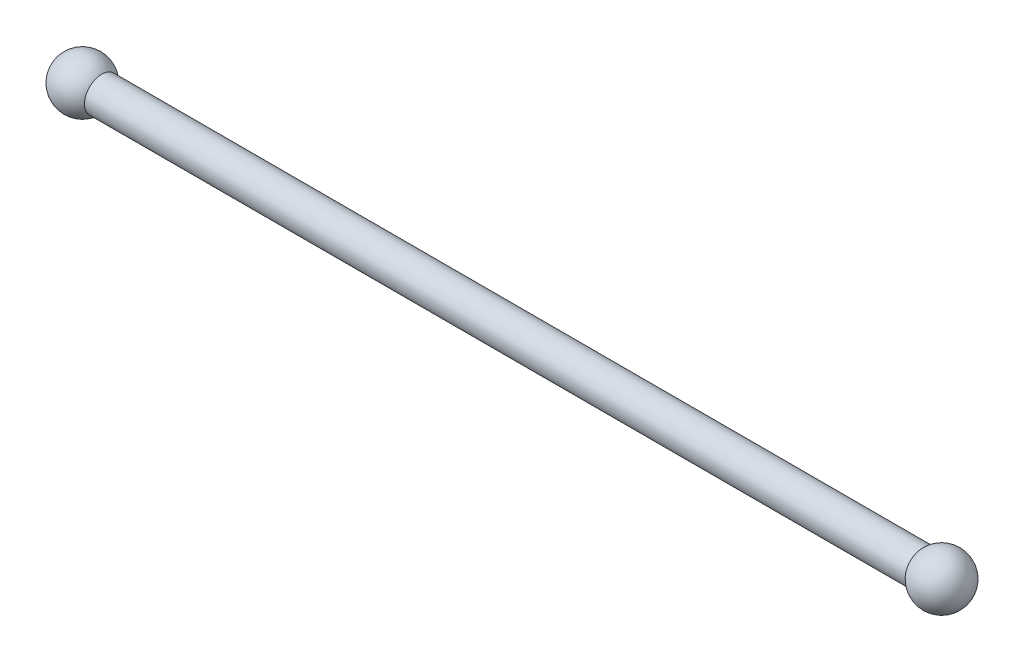
ISO-10303-21;
HEADER;
FILE_DESCRIPTION(('STEP AP214'),'2;1');
FILE_NAME('part.step','',(''),(''),'','','');
FILE_SCHEMA(('AUTOMOTIVE_DESIGN { 1 0 10303 214 1 1 1 1 }'));
ENDSEC;
DATA;
#1=APPLICATION_CONTEXT('core data for automotive mechanical design processes');
#2=APPLICATION_PROTOCOL_DEFINITION('international standard','automotive_design',2000,#1);
#3=PRODUCT_CONTEXT('',#1,'mechanical');
#4=PRODUCT('Part','Part','',(#3));
#5=PRODUCT_RELATED_PRODUCT_CATEGORY('part','',(#4));
#6=PRODUCT_DEFINITION_FORMATION('','',#4);
#7=PRODUCT_DEFINITION_CONTEXT('part definition',#1,'design');
#8=PRODUCT_DEFINITION('design','',#6,#7);
#9=PRODUCT_DEFINITION_SHAPE('','',#8);
#10=(LENGTH_UNIT() NAMED_UNIT(*) SI_UNIT(.MILLI.,.METRE.));
#11=(NAMED_UNIT(*) PLANE_ANGLE_UNIT() SI_UNIT($,.RADIAN.));
#12=(NAMED_UNIT(*) SI_UNIT($,.STERADIAN.) SOLID_ANGLE_UNIT());
#13=UNCERTAINTY_MEASURE_WITH_UNIT(LENGTH_MEASURE(1.E-05),#10,'distance_accuracy_value','');
#14=(GEOMETRIC_REPRESENTATION_CONTEXT(3) GLOBAL_UNCERTAINTY_ASSIGNED_CONTEXT((#13)) GLOBAL_UNIT_ASSIGNED_CONTEXT((#10,
#11,#12)) REPRESENTATION_CONTEXT('',''));
#15=CARTESIAN_POINT('',(0.,0.,0.));
#16=DIRECTION('',(0.,0.,1.));
#17=DIRECTION('',(1.,0.,0.));
#18=AXIS2_PLACEMENT_3D('',#15,#16,#17);
#19=CARTESIAN_POINT('',(0.,0.,0.));
#20=DIRECTION('',(-1.,0.,0.));
#21=DIRECTION('',(0.,0.,1.));
#22=AXIS2_PLACEMENT_3D('',#19,#20,#21);
#23=CYLINDRICAL_SURFACE('',#22,5.);
#24=CARTESIAN_POINT('',(119.409830056251,0.,0.));
#25=DIRECTION('',(1.,0.,0.));
#26=DIRECTION('',(0.,0.,-1.));
#27=AXIS2_PLACEMENT_3D('',#24,#25,#26);
#28=CIRCLE('',#27,5.);
#29=CARTESIAN_POINT('',(119.409830056251,0.,5.));
#30=VERTEX_POINT('',#29);
#31=EDGE_CURVE('E41',#30,#30,#28,.T.);
#32=CARTESIAN_POINT('',(-119.409830056251,0.,0.));
#33=DIRECTION('',(-1.,0.,0.));
#34=DIRECTION('',(0.,0.,1.));
#35=AXIS2_PLACEMENT_3D('',#32,#33,#34);
#36=CIRCLE('',#35,5.);
#37=CARTESIAN_POINT('',(-119.409830056251,0.,5.));
#38=VERTEX_POINT('',#37);
#39=EDGE_CURVE('E10',#38,#38,#36,.T.);
#40=CARTESIAN_POINT('',(119.409830056251,0.,5.));
#41=CARTESIAN_POINT('',(116.922125263412,0.,5.));
#42=CARTESIAN_POINT('',(114.434420470573,0.,5.));
#43=CARTESIAN_POINT('',(109.459010884896,0.,5.));
#44=CARTESIAN_POINT('',(106.971306092058,0.,5.));
#45=CARTESIAN_POINT('',(101.995896506381,0.,5.));
#46=CARTESIAN_POINT('',(99.5081917135421,0.,5.));
#47=CARTESIAN_POINT('',(94.532782127865,0.,5.));
#48=CARTESIAN_POINT('',(92.0450773350264,0.,5.));
#49=CARTESIAN_POINT('',(87.0696677493493,0.,5.));
#50=CARTESIAN_POINT('',(84.5819629565108,0.,5.));
#51=CARTESIAN_POINT('',(79.6065533708337,0.,5.));
#52=CARTESIAN_POINT('',(77.1188485779951,0.,5.));
#53=CARTESIAN_POINT('',(72.143438992318,0.,5.));
#54=CARTESIAN_POINT('',(69.6557341994795,0.,5.));
#55=CARTESIAN_POINT('',(64.6803246138024,0.,5.));
#56=CARTESIAN_POINT('',(62.1926198209638,0.,5.));
#57=CARTESIAN_POINT('',(57.2172102352867,0.,5.));
#58=CARTESIAN_POINT('',(54.7295054424482,0.,5.));
#59=CARTESIAN_POINT('',(49.7540958567711,0.,5.));
#60=CARTESIAN_POINT('',(47.2663910639325,0.,5.));
#61=CARTESIAN_POINT('',(42.2909814782554,0.,5.));
#62=CARTESIAN_POINT('',(39.8032766854168,0.,5.));
#63=CARTESIAN_POINT('',(34.8278670997397,0.,5.));
#64=CARTESIAN_POINT('',(32.3401623069012,0.,5.));
#65=CARTESIAN_POINT('',(27.3647527212241,0.,5.));
#66=CARTESIAN_POINT('',(24.8770479283855,0.,5.));
#67=CARTESIAN_POINT('',(19.9016383427084,0.,5.));
#68=CARTESIAN_POINT('',(17.4139335498699,0.,5.));
#69=CARTESIAN_POINT('',(12.4385239641928,0.,5.));
#70=CARTESIAN_POINT('',(9.95081917135421,0.,5.));
#71=CARTESIAN_POINT('',(4.9754095856771,0.,5.));
#72=CARTESIAN_POINT('',(2.48770479283855,0.,5.));
#73=CARTESIAN_POINT('',(-2.48770479283855,0.,5.));
#74=CARTESIAN_POINT('',(-4.9754095856771,0.,5.));
#75=CARTESIAN_POINT('',(-9.95081917135421,0.,5.));
#76=CARTESIAN_POINT('',(-12.4385239641928,0.,5.));
#77=CARTESIAN_POINT('',(-17.4139335498699,0.,5.));
#78=CARTESIAN_POINT('',(-19.9016383427084,0.,5.));
#79=CARTESIAN_POINT('',(-24.8770479283855,0.,5.));
#80=CARTESIAN_POINT('',(-27.3647527212241,0.,5.));
#81=CARTESIAN_POINT('',(-32.3401623069012,0.,5.));
#82=CARTESIAN_POINT('',(-34.8278670997397,0.,5.));
#83=CARTESIAN_POINT('',(-39.8032766854168,0.,5.));
#84=CARTESIAN_POINT('',(-42.2909814782554,0.,5.));
#85=CARTESIAN_POINT('',(-47.2663910639325,0.,5.));
#86=CARTESIAN_POINT('',(-49.754095856771,0.,5.));
#87=CARTESIAN_POINT('',(-54.7295054424482,0.,5.));
#88=CARTESIAN_POINT('',(-57.2172102352867,0.,5.));
#89=CARTESIAN_POINT('',(-62.1926198209638,0.,5.));
#90=CARTESIAN_POINT('',(-64.6803246138024,0.,5.));
#91=CARTESIAN_POINT('',(-69.6557341994795,0.,5.));
#92=CARTESIAN_POINT('',(-72.143438992318,0.,5.));
#93=CARTESIAN_POINT('',(-77.1188485779951,0.,5.));
#94=CARTESIAN_POINT('',(-79.6065533708337,0.,5.));
#95=CARTESIAN_POINT('',(-84.5819629565108,0.,5.));
#96=CARTESIAN_POINT('',(-87.0696677493493,0.,5.));
#97=CARTESIAN_POINT('',(-92.0450773350264,0.,5.));
#98=CARTESIAN_POINT('',(-94.532782127865,0.,5.));
#99=CARTESIAN_POINT('',(-99.5081917135421,0.,5.));
#100=CARTESIAN_POINT('',(-101.995896506381,0.,5.));
#101=CARTESIAN_POINT('',(-106.971306092058,0.,5.));
#102=CARTESIAN_POINT('',(-109.459010884896,0.,5.));
#103=CARTESIAN_POINT('',(-114.434420470573,0.,5.));
#104=CARTESIAN_POINT('',(-116.922125263412,0.,5.));
#105=CARTESIAN_POINT('',(-119.409830056251,0.,5.));
#106=B_SPLINE_CURVE_WITH_KNOTS('',3,(#40,#41,#42,#43,#44,#45,#46,#47,#48,#49,#50,#51,#52,#53,
#54,#55,#56,#57,#58,#59,#60,#61,#62,#63,#64,#65,#66,#67,#68,#69,#70,#71,#72,#73,#74,#75,#76,#77,
#78,#79,#80,#81,#82,#83,#84,#85,#86,#87,#88,#89,#90,#91,#92,#93,#94,#95,#96,#97,#98,#99,#100,
#101,#102,#103,#104,#105),.UNSPECIFIED.,.F.,.F.,(4,2,2,2,2,2,2,2,2,2,2,2,2,2,2,2,2,2,2,2,2,2,2,
2,2,2,2,2,2,2,2,2,4),(0.,7.46311437851566,14.9262287570313,22.389343135547,29.8524575140626,
37.3155718925783,44.778686271094,52.2418006496096,59.7049150281253,67.1680294066409,
74.6311437851566,82.0942581636722,89.5573725421879,97.0204869207036,104.483601299219,
111.946715677735,119.409830056251,126.872944434766,134.336058813282,141.799173191798,
149.262287570313,156.725401948829,164.188516327344,171.65163070586,179.114745084376,
186.577859462891,194.040973841407,201.504088219923,208.967202598438,216.430316976954,
223.89343135547,231.356545733985,238.819660112501),.UNSPECIFIED.);
#107=EDGE_CURVE('BSEAM35',#30,#38,#106,.T.);
#108=ORIENTED_EDGE('',*,*,#31,.F.);
#109=ORIENTED_EDGE('',*,*,#39,.F.);
#110=ORIENTED_EDGE('',*,*,#107,.T.);
#111=ORIENTED_EDGE('',*,*,#107,.F.);
#112=EDGE_LOOP('',(#108,#110,#109,#111));
#113=FACE_BOUND('',#112,.T.);
#114=ADVANCED_FACE('F35',(#113),#23,.T.);
#115=CARTESIAN_POINT('',(125.,0.,0.));
#116=DIRECTION('',(0.,0.,1.));
#117=DIRECTION('',(0.,1.,0.));
#118=AXIS2_PLACEMENT_3D('',#115,#116,#117);
#119=SPHERICAL_SURFACE('',#118,7.5);
#120=CARTESIAN_POINT('',(125.,0.,0.));
#121=DIRECTION('',(1.,0.,0.));
#122=DIRECTION('',(0.,0.,-1.));
#123=AXIS2_PLACEMENT_3D('',#120,#121,#122);
#124=SPHERICAL_SURFACE('',#123,7.5);
#125=ORIENTED_EDGE('',*,*,#31,.T.);
#126=EDGE_LOOP('',(#125));
#127=FACE_BOUND('',#126,.T.);
#128=ADVANCED_FACE('F47',(#127),#124,.T.);
#129=CARTESIAN_POINT('',(-125.,0.,0.));
#130=DIRECTION('',(0.,0.,1.));
#131=DIRECTION('',(0.,1.,0.));
#132=AXIS2_PLACEMENT_3D('',#129,#130,#131);
#133=SPHERICAL_SURFACE('',#132,7.5);
#134=CARTESIAN_POINT('',(-125.,0.,0.));
#135=DIRECTION('',(-1.,0.,0.));
#136=DIRECTION('',(0.,0.,1.));
#137=AXIS2_PLACEMENT_3D('',#134,#135,#136);
#138=SPHERICAL_SURFACE('',#137,7.5);
#139=ORIENTED_EDGE('',*,*,#39,.T.);
#140=EDGE_LOOP('',(#139));
#141=FACE_BOUND('',#140,.T.);
#142=ADVANCED_FACE('F54',(#141),#138,.T.);
#143=CLOSED_SHELL('',(#114,#128,#142));
#144=MANIFOLD_SOLID_BREP('B2',#143);
#145=ADVANCED_BREP_SHAPE_REPRESENTATION('',(#18,#144),#14);
#146=SHAPE_DEFINITION_REPRESENTATION(#9,#145);
ENDSEC;
END-ISO-10303-21;
